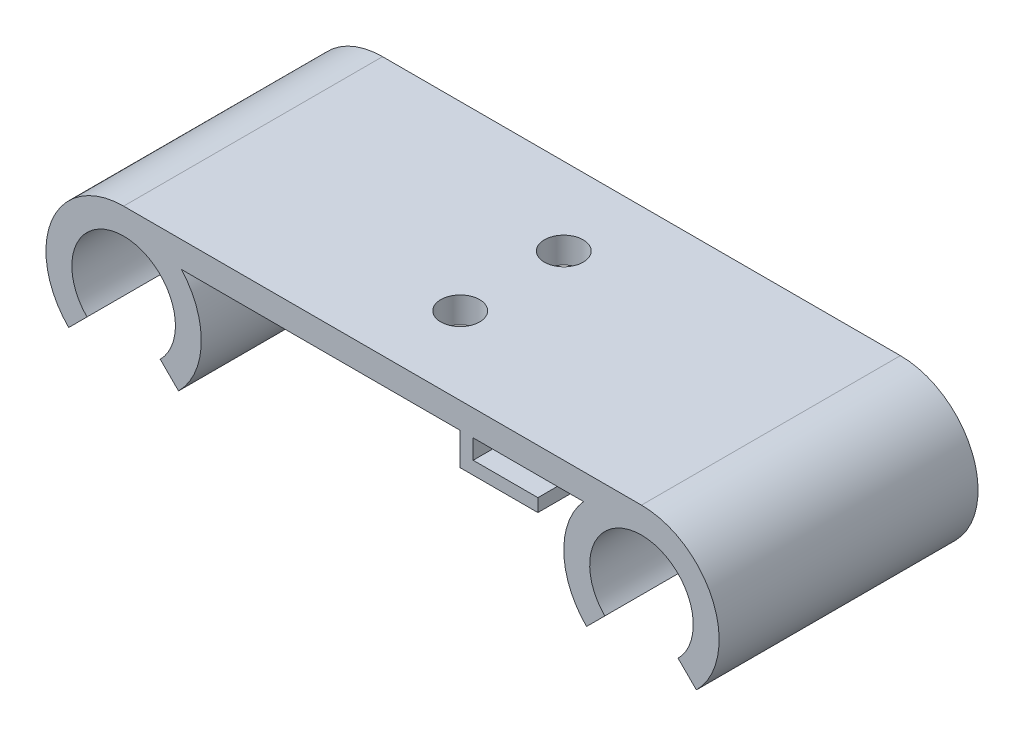
ISO-10303-21;
HEADER;
FILE_DESCRIPTION(('STEP AP214'),'2;1');
FILE_NAME('part.step','',(''),(''),'','','');
FILE_SCHEMA(('AUTOMOTIVE_DESIGN { 1 0 10303 214 1 1 1 1 }'));
ENDSEC;
DATA;
#1=APPLICATION_CONTEXT('core data for automotive mechanical design processes');
#2=APPLICATION_PROTOCOL_DEFINITION('international standard','automotive_design',2000,#1);
#3=PRODUCT_CONTEXT('',#1,'mechanical');
#4=PRODUCT('Part','Part','',(#3));
#5=PRODUCT_RELATED_PRODUCT_CATEGORY('part','',(#4));
#6=PRODUCT_DEFINITION_FORMATION('','',#4);
#7=PRODUCT_DEFINITION_CONTEXT('part definition',#1,'design');
#8=PRODUCT_DEFINITION('design','',#6,#7);
#9=PRODUCT_DEFINITION_SHAPE('','',#8);
#10=(LENGTH_UNIT() NAMED_UNIT(*) SI_UNIT(.MILLI.,.METRE.));
#11=(NAMED_UNIT(*) PLANE_ANGLE_UNIT() SI_UNIT($,.RADIAN.));
#12=(NAMED_UNIT(*) SI_UNIT($,.STERADIAN.) SOLID_ANGLE_UNIT());
#13=UNCERTAINTY_MEASURE_WITH_UNIT(LENGTH_MEASURE(1.E-05),#10,'distance_accuracy_value','');
#14=(GEOMETRIC_REPRESENTATION_CONTEXT(3) GLOBAL_UNCERTAINTY_ASSIGNED_CONTEXT((#13)) GLOBAL_UNIT_ASSIGNED_CONTEXT((#10,
#11,#12)) REPRESENTATION_CONTEXT('',''));
#15=CARTESIAN_POINT('',(0.,0.,0.));
#16=DIRECTION('',(0.,0.,1.));
#17=DIRECTION('',(1.,0.,0.));
#18=AXIS2_PLACEMENT_3D('',#15,#16,#17);
#19=CARTESIAN_POINT('',(6.,6.,20.));
#20=DIRECTION('',(0.,0.,-1.));
#21=DIRECTION('',(-1.,0.,0.));
#22=AXIS2_PLACEMENT_3D('',#19,#20,#21);
#23=CYLINDRICAL_SURFACE('',#22,6.);
#24=CARTESIAN_POINT('',(6.,6.,0.));
#25=DIRECTION('',(0.,0.,1.));
#26=DIRECTION('',(1.,0.,0.));
#27=AXIS2_PLACEMENT_3D('',#24,#25,#26);
#28=CIRCLE('',#27,6.);
#29=CARTESIAN_POINT('',(10.2426406871193,1.75735931288073,0.));
#30=VERTEX_POINT('',#29);
#31=CARTESIAN_POINT('',(10.4721359549996,10.,0.));
#32=VERTEX_POINT('',#31);
#33=EDGE_CURVE('E191',#30,#32,#28,.T.);
#34=ORIENTED_EDGE('',*,*,#33,.T.);
#35=DIRECTION('',(0.,0.,-1.));
#36=VECTOR('',#35,1.);
#37=CARTESIAN_POINT('',(10.4721359549996,10.,20.));
#38=LINE('',#37,#36);
#39=CARTESIAN_POINT('',(10.4721359549996,10.,20.));
#40=VERTEX_POINT('',#39);
#41=EDGE_CURVE('E11',#40,#32,#38,.T.);
#42=ORIENTED_EDGE('',*,*,#41,.F.);
#43=CARTESIAN_POINT('',(6.,6.,20.));
#44=DIRECTION('',(0.,0.,1.));
#45=DIRECTION('',(1.,0.,0.));
#46=AXIS2_PLACEMENT_3D('',#43,#44,#45);
#47=CIRCLE('',#46,6.);
#48=CARTESIAN_POINT('',(10.2426406871193,1.75735931288073,20.));
#49=VERTEX_POINT('',#48);
#50=EDGE_CURVE('E228',#49,#40,#47,.T.);
#51=ORIENTED_EDGE('',*,*,#50,.F.);
#52=DIRECTION('',(0.,0.,-1.));
#53=VECTOR('',#52,1.);
#54=CARTESIAN_POINT('',(10.2426406871193,1.75735931288073,20.));
#55=LINE('',#54,#53);
#56=EDGE_CURVE('E187',#49,#30,#55,.T.);
#57=ORIENTED_EDGE('',*,*,#56,.T.);
#58=EDGE_LOOP('',(#34,#42,#51,#57));
#59=FACE_BOUND('',#58,.T.);
#60=ADVANCED_FACE('F35',(#59),#23,.T.);
#61=CARTESIAN_POINT('',(0.,10.,20.));
#62=DIRECTION('',(0.,1.,0.));
#63=DIRECTION('',(0.,0.,1.));
#64=AXIS2_PLACEMENT_3D('',#61,#62,#63);
#65=PLANE('',#64);
#66=CARTESIAN_POINT('',(26.,10.,14.));
#67=DIRECTION('',(0.,1.,0.));
#68=DIRECTION('',(0.,0.,1.));
#69=AXIS2_PLACEMENT_3D('',#66,#67,#68);
#70=CIRCLE('',#69,1.5);
#71=CARTESIAN_POINT('',(26.,10.,15.5));
#72=VERTEX_POINT('',#71);
#73=EDGE_CURVE('E371',#72,#72,#70,.T.);
#74=ORIENTED_EDGE('',*,*,#73,.T.);
#75=EDGE_LOOP('',(#74));
#76=FACE_BOUND('',#75,.T.);
#77=CARTESIAN_POINT('',(26.,10.,6.));
#78=DIRECTION('',(0.,1.,0.));
#79=DIRECTION('',(0.,0.,1.));
#80=AXIS2_PLACEMENT_3D('',#77,#78,#79);
#81=CIRCLE('',#80,1.5);
#82=CARTESIAN_POINT('',(26.,10.,7.5));
#83=VERTEX_POINT('',#82);
#84=EDGE_CURVE('E195',#83,#83,#81,.T.);
#85=ORIENTED_EDGE('',*,*,#84,.T.);
#86=EDGE_LOOP('',(#85));
#87=FACE_BOUND('',#86,.T.);
#88=DIRECTION('',(1.,0.,0.));
#89=VECTOR('',#88,1.);
#90=CARTESIAN_POINT('',(0.,10.,0.));
#91=LINE('',#90,#89);
#92=CARTESIAN_POINT('',(32.,10.,0.));
#93=VERTEX_POINT('',#92);
#94=EDGE_CURVE('E194',#32,#93,#91,.T.);
#95=ORIENTED_EDGE('',*,*,#94,.T.);
#96=DIRECTION('',(0.,0.,-1.));
#97=VECTOR('',#96,1.);
#98=CARTESIAN_POINT('',(32.,10.,20.));
#99=LINE('',#98,#97);
#100=CARTESIAN_POINT('',(32.,10.,20.));
#101=VERTEX_POINT('',#100);
#102=EDGE_CURVE('E44',#101,#93,#99,.T.);
#103=ORIENTED_EDGE('',*,*,#102,.F.);
#104=DIRECTION('',(1.,0.,0.));
#105=VECTOR('',#104,1.);
#106=CARTESIAN_POINT('',(0.,10.,20.));
#107=LINE('',#106,#105);
#108=EDGE_CURVE('E121',#40,#101,#107,.T.);
#109=ORIENTED_EDGE('',*,*,#108,.F.);
#110=ORIENTED_EDGE('',*,*,#41,.T.);
#111=EDGE_LOOP('',(#95,#103,#109,#110));
#112=FACE_BOUND('',#111,.T.);
#113=ADVANCED_FACE('F334',(#76,#87,#112),#65,.F.);
#114=CARTESIAN_POINT('',(32.,0.,20.));
#115=DIRECTION('',(1.,0.,0.));
#116=DIRECTION('',(0.,0.,-1.));
#117=AXIS2_PLACEMENT_3D('',#114,#115,#116);
#118=PLANE('',#117);
#119=DIRECTION('',(0.,-1.,0.));
#120=VECTOR('',#119,1.);
#121=CARTESIAN_POINT('',(32.,0.,0.));
#122=LINE('',#121,#120);
#123=CARTESIAN_POINT('',(32.,7.5,0.));
#124=VERTEX_POINT('',#123);
#125=EDGE_CURVE('E198',#93,#124,#122,.T.);
#126=ORIENTED_EDGE('',*,*,#125,.T.);
#127=DIRECTION('',(0.,0.,-1.));
#128=VECTOR('',#127,1.);
#129=CARTESIAN_POINT('',(32.,7.5,20.));
#130=LINE('',#129,#128);
#131=CARTESIAN_POINT('',(32.,7.5,20.));
#132=VERTEX_POINT('',#131);
#133=EDGE_CURVE('E260',#132,#124,#130,.T.);
#134=ORIENTED_EDGE('',*,*,#133,.F.);
#135=DIRECTION('',(0.,-1.,0.));
#136=VECTOR('',#135,1.);
#137=CARTESIAN_POINT('',(32.,0.,20.));
#138=LINE('',#137,#136);
#139=EDGE_CURVE('E267',#101,#132,#138,.T.);
#140=ORIENTED_EDGE('',*,*,#139,.F.);
#141=ORIENTED_EDGE('',*,*,#102,.T.);
#142=EDGE_LOOP('',(#126,#134,#140,#141));
#143=FACE_BOUND('',#142,.T.);
#144=ADVANCED_FACE('F37',(#143),#118,.F.);
#145=CARTESIAN_POINT('',(0.,7.5,20.));
#146=DIRECTION('',(0.,1.,0.));
#147=DIRECTION('',(0.,0.,1.));
#148=AXIS2_PLACEMENT_3D('',#145,#146,#147);
#149=PLANE('',#148);
#150=DIRECTION('',(1.,0.,0.));
#151=VECTOR('',#150,1.);
#152=CARTESIAN_POINT('',(0.,7.5,0.));
#153=LINE('',#152,#151);
#154=CARTESIAN_POINT('',(38.,7.5,0.));
#155=VERTEX_POINT('',#154);
#156=EDGE_CURVE('E201',#124,#155,#153,.T.);
#157=ORIENTED_EDGE('',*,*,#156,.T.);
#158=DIRECTION('',(0.,0.,-1.));
#159=VECTOR('',#158,1.);
#160=CARTESIAN_POINT('',(38.,7.5,20.));
#161=LINE('',#160,#159);
#162=CARTESIAN_POINT('',(38.,7.5,20.));
#163=VERTEX_POINT('',#162);
#164=EDGE_CURVE('E257',#163,#155,#161,.T.);
#165=ORIENTED_EDGE('',*,*,#164,.F.);
#166=DIRECTION('',(1.,0.,0.));
#167=VECTOR('',#166,1.);
#168=CARTESIAN_POINT('',(0.,7.5,20.));
#169=LINE('',#168,#167);
#170=EDGE_CURVE('E285',#132,#163,#169,.T.);
#171=ORIENTED_EDGE('',*,*,#170,.F.);
#172=ORIENTED_EDGE('',*,*,#133,.T.);
#173=EDGE_LOOP('',(#157,#165,#171,#172));
#174=FACE_BOUND('',#173,.T.);
#175=ADVANCED_FACE('F276',(#174),#149,.F.);
#176=CARTESIAN_POINT('',(38.,0.,20.));
#177=DIRECTION('',(-1.,0.,0.));
#178=DIRECTION('',(0.,0.,1.));
#179=AXIS2_PLACEMENT_3D('',#176,#177,#178);
#180=PLANE('',#179);
#181=DIRECTION('',(0.,1.,0.));
#182=VECTOR('',#181,1.);
#183=CARTESIAN_POINT('',(38.,0.,0.));
#184=LINE('',#183,#182);
#185=CARTESIAN_POINT('',(38.,8.5,0.));
#186=VERTEX_POINT('',#185);
#187=EDGE_CURVE('E203',#155,#186,#184,.T.);
#188=ORIENTED_EDGE('',*,*,#187,.T.);
#189=DIRECTION('',(0.,0.,-1.));
#190=VECTOR('',#189,1.);
#191=CARTESIAN_POINT('',(38.,8.5,20.));
#192=LINE('',#191,#190);
#193=CARTESIAN_POINT('',(38.,8.5,20.));
#194=VERTEX_POINT('',#193);
#195=EDGE_CURVE('E254',#194,#186,#192,.T.);
#196=ORIENTED_EDGE('',*,*,#195,.F.);
#197=DIRECTION('',(0.,1.,0.));
#198=VECTOR('',#197,1.);
#199=CARTESIAN_POINT('',(38.,0.,20.));
#200=LINE('',#199,#198);
#201=EDGE_CURVE('E282',#163,#194,#200,.T.);
#202=ORIENTED_EDGE('',*,*,#201,.F.);
#203=ORIENTED_EDGE('',*,*,#164,.T.);
#204=EDGE_LOOP('',(#188,#196,#202,#203));
#205=FACE_BOUND('',#204,.T.);
#206=ADVANCED_FACE('F280',(#205),#180,.F.);
#207=CARTESIAN_POINT('',(0.,8.5,20.));
#208=DIRECTION('',(0.,-1.,0.));
#209=DIRECTION('',(0.,0.,-1.));
#210=AXIS2_PLACEMENT_3D('',#207,#208,#209);
#211=PLANE('',#210);
#212=DIRECTION('',(-1.,0.,0.));
#213=VECTOR('',#212,1.);
#214=CARTESIAN_POINT('',(0.,8.5,0.));
#215=LINE('',#214,#213);
#216=CARTESIAN_POINT('',(33.,8.5,0.));
#217=VERTEX_POINT('',#216);
#218=EDGE_CURVE('E205',#186,#217,#215,.T.);
#219=ORIENTED_EDGE('',*,*,#218,.T.);
#220=DIRECTION('',(0.,0.,-1.));
#221=VECTOR('',#220,1.);
#222=CARTESIAN_POINT('',(33.,8.5,20.));
#223=LINE('',#222,#221);
#224=CARTESIAN_POINT('',(33.,8.5,20.));
#225=VERTEX_POINT('',#224);
#226=EDGE_CURVE('E251',#225,#217,#223,.T.);
#227=ORIENTED_EDGE('',*,*,#226,.F.);
#228=DIRECTION('',(-1.,0.,0.));
#229=VECTOR('',#228,1.);
#230=CARTESIAN_POINT('',(0.,8.5,20.));
#231=LINE('',#230,#229);
#232=EDGE_CURVE('E284',#194,#225,#231,.T.);
#233=ORIENTED_EDGE('',*,*,#232,.F.);
#234=ORIENTED_EDGE('',*,*,#195,.T.);
#235=EDGE_LOOP('',(#219,#227,#233,#234));
#236=FACE_BOUND('',#235,.T.);
#237=ADVANCED_FACE('F405',(#236),#211,.F.);
#238=CARTESIAN_POINT('',(33.,0.,20.));
#239=DIRECTION('',(-1.,0.,0.));
#240=DIRECTION('',(0.,0.,1.));
#241=AXIS2_PLACEMENT_3D('',#238,#239,#240);
#242=PLANE('',#241);
#243=DIRECTION('',(0.,1.,0.));
#244=VECTOR('',#243,1.);
#245=CARTESIAN_POINT('',(33.,0.,0.));
#246=LINE('',#245,#244);
#247=CARTESIAN_POINT('',(33.,10.,0.));
#248=VERTEX_POINT('',#247);
#249=EDGE_CURVE('E207',#217,#248,#246,.T.);
#250=ORIENTED_EDGE('',*,*,#249,.T.);
#251=DIRECTION('',(0.,0.,-1.));
#252=VECTOR('',#251,1.);
#253=CARTESIAN_POINT('',(33.,10.,20.));
#254=LINE('',#253,#252);
#255=CARTESIAN_POINT('',(33.,10.,20.));
#256=VERTEX_POINT('',#255);
#257=EDGE_CURVE('E248',#256,#248,#254,.T.);
#258=ORIENTED_EDGE('',*,*,#257,.F.);
#259=DIRECTION('',(0.,1.,0.));
#260=VECTOR('',#259,1.);
#261=CARTESIAN_POINT('',(33.,0.,20.));
#262=LINE('',#261,#260);
#263=EDGE_CURVE('E287',#225,#256,#262,.T.);
#264=ORIENTED_EDGE('',*,*,#263,.F.);
#265=ORIENTED_EDGE('',*,*,#226,.T.);
#266=EDGE_LOOP('',(#250,#258,#264,#265));
#267=FACE_BOUND('',#266,.T.);
#268=ADVANCED_FACE('F402',(#267),#242,.F.);
#269=CARTESIAN_POINT('',(41.5278640450004,10.,0.));
#270=VERTEX_POINT('',#269);
#271=EDGE_CURVE('E199',#248,#270,#91,.T.);
#272=ORIENTED_EDGE('',*,*,#271,.T.);
#273=DIRECTION('',(0.,0.,-1.));
#274=VECTOR('',#273,1.);
#275=CARTESIAN_POINT('',(41.5278640450004,10.,20.));
#276=LINE('',#275,#274);
#277=CARTESIAN_POINT('',(41.5278640450004,10.,20.));
#278=VERTEX_POINT('',#277);
#279=EDGE_CURVE('E245',#278,#270,#276,.T.);
#280=ORIENTED_EDGE('',*,*,#279,.F.);
#281=EDGE_CURVE('E293',#256,#278,#107,.T.);
#282=ORIENTED_EDGE('',*,*,#281,.F.);
#283=ORIENTED_EDGE('',*,*,#257,.T.);
#284=EDGE_LOOP('',(#272,#280,#282,#283));
#285=FACE_BOUND('',#284,.T.);
#286=ADVANCED_FACE('F341',(#285),#65,.F.);
#287=CARTESIAN_POINT('',(46.,6.,20.));
#288=DIRECTION('',(0.,0.,-1.));
#289=DIRECTION('',(-1.,0.,0.));
#290=AXIS2_PLACEMENT_3D('',#287,#288,#289);
#291=CYLINDRICAL_SURFACE('',#290,6.);
#292=CARTESIAN_POINT('',(46.,6.,0.));
#293=DIRECTION('',(0.,0.,1.));
#294=DIRECTION('',(1.,0.,0.));
#295=AXIS2_PLACEMENT_3D('',#292,#293,#294);
#296=CIRCLE('',#295,6.);
#297=CARTESIAN_POINT('',(41.7573593128807,1.75735931288072,0.));
#298=VERTEX_POINT('',#297);
#299=EDGE_CURVE('E209',#270,#298,#296,.T.);
#300=ORIENTED_EDGE('',*,*,#299,.T.);
#301=DIRECTION('',(0.,0.,-1.));
#302=VECTOR('',#301,1.);
#303=CARTESIAN_POINT('',(41.7573593128807,1.75735931288072,20.));
#304=LINE('',#303,#302);
#305=CARTESIAN_POINT('',(41.7573593128807,1.75735931288072,20.));
#306=VERTEX_POINT('',#305);
#307=EDGE_CURVE('E243',#306,#298,#304,.T.);
#308=ORIENTED_EDGE('',*,*,#307,.F.);
#309=CARTESIAN_POINT('',(46.,6.,20.));
#310=DIRECTION('',(0.,0.,1.));
#311=DIRECTION('',(1.,0.,0.));
#312=AXIS2_PLACEMENT_3D('',#309,#310,#311);
#313=CIRCLE('',#312,6.);
#314=EDGE_CURVE('E294',#278,#306,#313,.T.);
#315=ORIENTED_EDGE('',*,*,#314,.F.);
#316=ORIENTED_EDGE('',*,*,#279,.T.);
#317=EDGE_LOOP('',(#300,#308,#315,#316));
#318=FACE_BOUND('',#317,.T.);
#319=ADVANCED_FACE('F391',(#318),#291,.T.);
#320=CARTESIAN_POINT('',(19.9999999999999,-20.,20.));
#321=DIRECTION('',(0.707106781186547,-0.707106781186548,0.));
#322=DIRECTION('',(0.707106781186548,0.707106781186547,0.));
#323=AXIS2_PLACEMENT_3D('',#320,#321,#322);
#324=PLANE('',#323);
#325=DIRECTION('',(-0.707106781186548,-0.707106781186547,0.));
#326=VECTOR('',#325,1.);
#327=CARTESIAN_POINT('',(19.9999999999999,-20.,0.));
#328=LINE('',#327,#326);
#329=CARTESIAN_POINT('',(43.1715728752538,3.17157287525381,0.));
#330=VERTEX_POINT('',#329);
#331=EDGE_CURVE('E212',#330,#298,#328,.T.);
#332=ORIENTED_EDGE('',*,*,#331,.F.);
#333=DIRECTION('',(0.,0.,-1.));
#334=VECTOR('',#333,1.);
#335=CARTESIAN_POINT('',(43.1715728752538,3.17157287525381,20.));
#336=LINE('',#335,#334);
#337=CARTESIAN_POINT('',(43.1715728752538,3.17157287525381,20.));
#338=VERTEX_POINT('',#337);
#339=EDGE_CURVE('E241',#338,#330,#336,.T.);
#340=ORIENTED_EDGE('',*,*,#339,.F.);
#341=DIRECTION('',(-0.707106781186548,-0.707106781186547,0.));
#342=VECTOR('',#341,1.);
#343=CARTESIAN_POINT('',(19.9999999999999,-20.,20.));
#344=LINE('',#343,#342);
#345=EDGE_CURVE('E296',#338,#306,#344,.T.);
#346=ORIENTED_EDGE('',*,*,#345,.T.);
#347=ORIENTED_EDGE('',*,*,#307,.T.);
#348=EDGE_LOOP('',(#332,#340,#346,#347));
#349=FACE_BOUND('',#348,.T.);
#350=ADVANCED_FACE('F394',(#349),#324,.T.);
#351=CARTESIAN_POINT('',(46.,6.,20.));
#352=DIRECTION('',(0.,0.,-1.));
#353=DIRECTION('',(-1.,0.,0.));
#354=AXIS2_PLACEMENT_3D('',#351,#352,#353);
#355=CYLINDRICAL_SURFACE('',#354,4.00000000000001);
#356=CARTESIAN_POINT('',(46.,6.,0.));
#357=DIRECTION('',(0.,0.,1.));
#358=DIRECTION('',(1.,0.,0.));
#359=AXIS2_PLACEMENT_3D('',#356,#357,#358);
#360=CIRCLE('',#359,4.00000000000001);
#361=CARTESIAN_POINT('',(48.8284271247462,3.1715728752538,0.));
#362=VERTEX_POINT('',#361);
#363=EDGE_CURVE('E216',#362,#330,#360,.T.);
#364=ORIENTED_EDGE('',*,*,#363,.F.);
#365=DIRECTION('',(0.,0.,-1.));
#366=VECTOR('',#365,1.);
#367=CARTESIAN_POINT('',(48.8284271247462,3.1715728752538,20.));
#368=LINE('',#367,#366);
#369=CARTESIAN_POINT('',(48.8284271247462,3.1715728752538,20.));
#370=VERTEX_POINT('',#369);
#371=EDGE_CURVE('E239',#370,#362,#368,.T.);
#372=ORIENTED_EDGE('',*,*,#371,.F.);
#373=CARTESIAN_POINT('',(46.,6.,20.));
#374=DIRECTION('',(0.,0.,1.));
#375=DIRECTION('',(1.,0.,0.));
#376=AXIS2_PLACEMENT_3D('',#373,#374,#375);
#377=CIRCLE('',#376,4.00000000000001);
#378=EDGE_CURVE('E300',#370,#338,#377,.T.);
#379=ORIENTED_EDGE('',*,*,#378,.T.);
#380=ORIENTED_EDGE('',*,*,#339,.T.);
#381=EDGE_LOOP('',(#364,#372,#379,#380));
#382=FACE_BOUND('',#381,.T.);
#383=ADVANCED_FACE('F397',(#382),#355,.F.);
#384=CARTESIAN_POINT('',(26.,26.,20.));
#385=DIRECTION('',(0.707106781186548,0.707106781186547,0.));
#386=DIRECTION('',(-0.707106781186547,0.707106781186548,0.));
#387=AXIS2_PLACEMENT_3D('',#384,#385,#386);
#388=PLANE('',#387);
#389=DIRECTION('',(0.707106781186547,-0.707106781186548,0.));
#390=VECTOR('',#389,1.);
#391=CARTESIAN_POINT('',(26.,26.,0.));
#392=LINE('',#391,#390);
#393=CARTESIAN_POINT('',(50.2426406871193,1.75735931288071,0.));
#394=VERTEX_POINT('',#393);
#395=EDGE_CURVE('E219',#362,#394,#392,.T.);
#396=ORIENTED_EDGE('',*,*,#395,.T.);
#397=DIRECTION('',(0.,0.,-1.));
#398=VECTOR('',#397,1.);
#399=CARTESIAN_POINT('',(50.2426406871193,1.75735931288071,20.));
#400=LINE('',#399,#398);
#401=CARTESIAN_POINT('',(50.2426406871193,1.75735931288071,20.));
#402=VERTEX_POINT('',#401);
#403=EDGE_CURVE('E236',#402,#394,#400,.T.);
#404=ORIENTED_EDGE('',*,*,#403,.F.);
#405=DIRECTION('',(0.707106781186547,-0.707106781186548,0.));
#406=VECTOR('',#405,1.);
#407=CARTESIAN_POINT('',(26.,26.,20.));
#408=LINE('',#407,#406);
#409=EDGE_CURVE('E303',#370,#402,#408,.T.);
#410=ORIENTED_EDGE('',*,*,#409,.F.);
#411=ORIENTED_EDGE('',*,*,#371,.T.);
#412=EDGE_LOOP('',(#396,#404,#410,#411));
#413=FACE_BOUND('',#412,.T.);
#414=ADVANCED_FACE('F399',(#413),#388,.F.);
#415=CARTESIAN_POINT('',(46.,12.,0.));
#416=VERTEX_POINT('',#415);
#417=EDGE_CURVE('E213',#394,#416,#296,.T.);
#418=ORIENTED_EDGE('',*,*,#417,.T.);
#419=DIRECTION('',(0.,0.,-1.));
#420=VECTOR('',#419,1.);
#421=CARTESIAN_POINT('',(46.,12.,20.));
#422=LINE('',#421,#420);
#423=CARTESIAN_POINT('',(46.,12.,20.));
#424=VERTEX_POINT('',#423);
#425=EDGE_CURVE('E234',#424,#416,#422,.T.);
#426=ORIENTED_EDGE('',*,*,#425,.F.);
#427=EDGE_CURVE('E297',#402,#424,#313,.T.);
#428=ORIENTED_EDGE('',*,*,#427,.F.);
#429=ORIENTED_EDGE('',*,*,#403,.T.);
#430=EDGE_LOOP('',(#418,#426,#428,#429));
#431=FACE_BOUND('',#430,.T.);
#432=ADVANCED_FACE('F315',(#431),#291,.T.);
#433=CARTESIAN_POINT('',(0.,12.,20.));
#434=DIRECTION('',(0.,1.,0.));
#435=DIRECTION('',(0.,0.,1.));
#436=AXIS2_PLACEMENT_3D('',#433,#434,#435);
#437=PLANE('',#436);
#438=CARTESIAN_POINT('',(26.,12.,14.));
#439=DIRECTION('',(0.,1.,0.));
#440=DIRECTION('',(0.,0.,1.));
#441=AXIS2_PLACEMENT_3D('',#438,#439,#440);
#442=CIRCLE('',#441,1.5);
#443=CARTESIAN_POINT('',(26.,12.,15.5));
#444=VERTEX_POINT('',#443);
#445=EDGE_CURVE('E368',#444,#444,#442,.T.);
#446=ORIENTED_EDGE('',*,*,#445,.F.);
#447=EDGE_LOOP('',(#446));
#448=FACE_BOUND('',#447,.T.);
#449=CARTESIAN_POINT('',(26.,12.,6.));
#450=DIRECTION('',(0.,1.,0.));
#451=DIRECTION('',(0.,0.,1.));
#452=AXIS2_PLACEMENT_3D('',#449,#450,#451);
#453=CIRCLE('',#452,1.5);
#454=CARTESIAN_POINT('',(26.,12.,7.5));
#455=VERTEX_POINT('',#454);
#456=EDGE_CURVE('E372',#455,#455,#453,.T.);
#457=ORIENTED_EDGE('',*,*,#456,.F.);
#458=EDGE_LOOP('',(#457));
#459=FACE_BOUND('',#458,.T.);
#460=DIRECTION('',(1.,0.,0.));
#461=VECTOR('',#460,1.);
#462=CARTESIAN_POINT('',(0.,12.,0.));
#463=LINE('',#462,#461);
#464=CARTESIAN_POINT('',(6.,12.,0.));
#465=VERTEX_POINT('',#464);
#466=EDGE_CURVE('E221',#465,#416,#463,.T.);
#467=ORIENTED_EDGE('',*,*,#466,.F.);
#468=DIRECTION('',(0.,0.,-1.));
#469=VECTOR('',#468,1.);
#470=CARTESIAN_POINT('',(6.,12.,20.));
#471=LINE('',#470,#469);
#472=CARTESIAN_POINT('',(6.,12.,20.));
#473=VERTEX_POINT('',#472);
#474=EDGE_CURVE('E232',#473,#465,#471,.T.);
#475=ORIENTED_EDGE('',*,*,#474,.F.);
#476=DIRECTION('',(1.,0.,0.));
#477=VECTOR('',#476,1.);
#478=CARTESIAN_POINT('',(0.,12.,20.));
#479=LINE('',#478,#477);
#480=EDGE_CURVE('E304',#473,#424,#479,.T.);
#481=ORIENTED_EDGE('',*,*,#480,.T.);
#482=ORIENTED_EDGE('',*,*,#425,.T.);
#483=EDGE_LOOP('',(#467,#475,#481,#482));
#484=FACE_BOUND('',#483,.T.);
#485=ADVANCED_FACE('F318',(#448,#459,#484),#437,.T.);
#486=CARTESIAN_POINT('',(1.75735931288071,1.75735931288071,0.));
#487=VERTEX_POINT('',#486);
#488=EDGE_CURVE('E196',#465,#487,#28,.T.);
#489=ORIENTED_EDGE('',*,*,#488,.T.);
#490=DIRECTION('',(0.,0.,-1.));
#491=VECTOR('',#490,1.);
#492=CARTESIAN_POINT('',(1.75735931288071,1.75735931288071,20.));
#493=LINE('',#492,#491);
#494=CARTESIAN_POINT('',(1.75735931288071,1.75735931288071,20.));
#495=VERTEX_POINT('',#494);
#496=EDGE_CURVE('E176',#495,#487,#493,.T.);
#497=ORIENTED_EDGE('',*,*,#496,.F.);
#498=EDGE_CURVE('E182',#473,#495,#47,.T.);
#499=ORIENTED_EDGE('',*,*,#498,.F.);
#500=ORIENTED_EDGE('',*,*,#474,.T.);
#501=EDGE_LOOP('',(#489,#497,#499,#500));
#502=FACE_BOUND('',#501,.T.);
#503=ADVANCED_FACE('F323',(#502),#23,.T.);
#504=CARTESIAN_POINT('',(0.,0.,20.));
#505=DIRECTION('',(0.707106781186548,-0.707106781186548,0.));
#506=DIRECTION('',(0.707106781186548,0.707106781186548,0.));
#507=AXIS2_PLACEMENT_3D('',#504,#505,#506);
#508=PLANE('',#507);
#509=DIRECTION('',(-0.707106781186548,-0.707106781186548,0.));
#510=VECTOR('',#509,1.);
#511=CARTESIAN_POINT('',(0.,0.,0.));
#512=LINE('',#511,#510);
#513=CARTESIAN_POINT('',(3.17157287525381,3.17157287525381,0.));
#514=VERTEX_POINT('',#513);
#515=EDGE_CURVE('E171',#514,#487,#512,.T.);
#516=ORIENTED_EDGE('',*,*,#515,.F.);
#517=DIRECTION('',(0.,0.,-1.));
#518=VECTOR('',#517,1.);
#519=CARTESIAN_POINT('',(3.17157287525381,3.17157287525381,20.));
#520=LINE('',#519,#518);
#521=CARTESIAN_POINT('',(3.17157287525381,3.17157287525381,20.));
#522=VERTEX_POINT('',#521);
#523=EDGE_CURVE('E166',#522,#514,#520,.T.);
#524=ORIENTED_EDGE('',*,*,#523,.F.);
#525=DIRECTION('',(-0.707106781186548,-0.707106781186548,0.));
#526=VECTOR('',#525,1.);
#527=CARTESIAN_POINT('',(0.,0.,20.));
#528=LINE('',#527,#526);
#529=EDGE_CURVE('E169',#522,#495,#528,.T.);
#530=ORIENTED_EDGE('',*,*,#529,.T.);
#531=ORIENTED_EDGE('',*,*,#496,.T.);
#532=EDGE_LOOP('',(#516,#524,#530,#531));
#533=FACE_BOUND('',#532,.T.);
#534=ADVANCED_FACE('F168',(#533),#508,.T.);
#535=CARTESIAN_POINT('',(6.,6.,20.));
#536=DIRECTION('',(0.,0.,-1.));
#537=DIRECTION('',(-1.,0.,0.));
#538=AXIS2_PLACEMENT_3D('',#535,#536,#537);
#539=CYLINDRICAL_SURFACE('',#538,4.);
#540=CARTESIAN_POINT('',(6.,6.,0.));
#541=DIRECTION('',(0.,0.,1.));
#542=DIRECTION('',(1.,0.,0.));
#543=AXIS2_PLACEMENT_3D('',#540,#541,#542);
#544=CIRCLE('',#543,4.);
#545=CARTESIAN_POINT('',(8.8284271247462,3.17157287525382,0.));
#546=VERTEX_POINT('',#545);
#547=EDGE_CURVE('E225',#546,#514,#544,.T.);
#548=ORIENTED_EDGE('',*,*,#547,.F.);
#549=DIRECTION('',(0.,0.,-1.));
#550=VECTOR('',#549,1.);
#551=CARTESIAN_POINT('',(8.8284271247462,3.17157287525382,20.));
#552=LINE('',#551,#550);
#553=CARTESIAN_POINT('',(8.8284271247462,3.17157287525382,20.));
#554=VERTEX_POINT('',#553);
#555=EDGE_CURVE('E110',#554,#546,#552,.T.);
#556=ORIENTED_EDGE('',*,*,#555,.F.);
#557=CARTESIAN_POINT('',(6.,6.,20.));
#558=DIRECTION('',(0.,0.,1.));
#559=DIRECTION('',(1.,0.,0.));
#560=AXIS2_PLACEMENT_3D('',#557,#558,#559);
#561=CIRCLE('',#560,4.);
#562=EDGE_CURVE('E179',#554,#522,#561,.T.);
#563=ORIENTED_EDGE('',*,*,#562,.T.);
#564=ORIENTED_EDGE('',*,*,#523,.T.);
#565=EDGE_LOOP('',(#548,#556,#563,#564));
#566=FACE_BOUND('',#565,.T.);
#567=ADVANCED_FACE('F185',(#566),#539,.F.);
#568=CARTESIAN_POINT('',(5.99999999999998,6.00000000000002,20.));
#569=DIRECTION('',(0.707106781186545,0.70710678118655,0.));
#570=DIRECTION('',(-0.70710678118655,0.707106781186545,0.));
#571=AXIS2_PLACEMENT_3D('',#568,#569,#570);
#572=PLANE('',#571);
#573=DIRECTION('',(0.70710678118655,-0.707106781186545,0.));
#574=VECTOR('',#573,1.);
#575=CARTESIAN_POINT('',(5.99999999999998,6.00000000000002,0.));
#576=LINE('',#575,#574);
#577=EDGE_CURVE('E113',#546,#30,#576,.T.);
#578=ORIENTED_EDGE('',*,*,#577,.T.);
#579=ORIENTED_EDGE('',*,*,#56,.F.);
#580=DIRECTION('',(0.70710678118655,-0.707106781186545,0.));
#581=VECTOR('',#580,1.);
#582=CARTESIAN_POINT('',(5.99999999999998,6.00000000000002,20.));
#583=LINE('',#582,#581);
#584=EDGE_CURVE('E52',#554,#49,#583,.T.);
#585=ORIENTED_EDGE('',*,*,#584,.F.);
#586=ORIENTED_EDGE('',*,*,#555,.T.);
#587=EDGE_LOOP('',(#578,#579,#585,#586));
#588=FACE_BOUND('',#587,.T.);
#589=ADVANCED_FACE('F344',(#588),#572,.F.);
#590=CARTESIAN_POINT('',(0.,0.,20.));
#591=DIRECTION('',(0.,0.,1.));
#592=DIRECTION('',(1.,0.,0.));
#593=AXIS2_PLACEMENT_3D('',#590,#591,#592);
#594=PLANE('',#593);
#595=ORIENTED_EDGE('',*,*,#50,.T.);
#596=ORIENTED_EDGE('',*,*,#108,.T.);
#597=ORIENTED_EDGE('',*,*,#139,.T.);
#598=ORIENTED_EDGE('',*,*,#170,.T.);
#599=ORIENTED_EDGE('',*,*,#201,.T.);
#600=ORIENTED_EDGE('',*,*,#232,.T.);
#601=ORIENTED_EDGE('',*,*,#263,.T.);
#602=ORIENTED_EDGE('',*,*,#281,.T.);
#603=ORIENTED_EDGE('',*,*,#314,.T.);
#604=ORIENTED_EDGE('',*,*,#345,.F.);
#605=ORIENTED_EDGE('',*,*,#378,.F.);
#606=ORIENTED_EDGE('',*,*,#409,.T.);
#607=ORIENTED_EDGE('',*,*,#427,.T.);
#608=ORIENTED_EDGE('',*,*,#480,.F.);
#609=ORIENTED_EDGE('',*,*,#498,.T.);
#610=ORIENTED_EDGE('',*,*,#529,.F.);
#611=ORIENTED_EDGE('',*,*,#562,.F.);
#612=ORIENTED_EDGE('',*,*,#584,.T.);
#613=EDGE_LOOP('',(#595,#596,#597,#598,#599,#600,#601,#602,#603,#604,#605,#606,#607,#608,#609,
#610,#611,#612));
#614=FACE_BOUND('',#613,.T.);
#615=ADVANCED_FACE('F178',(#614),#594,.T.);
#616=CARTESIAN_POINT('',(0.,0.,0.));
#617=DIRECTION('',(0.,0.,1.));
#618=DIRECTION('',(1.,0.,0.));
#619=AXIS2_PLACEMENT_3D('',#616,#617,#618);
#620=PLANE('',#619);
#621=ORIENTED_EDGE('',*,*,#33,.F.);
#622=ORIENTED_EDGE('',*,*,#577,.F.);
#623=ORIENTED_EDGE('',*,*,#547,.T.);
#624=ORIENTED_EDGE('',*,*,#515,.T.);
#625=ORIENTED_EDGE('',*,*,#488,.F.);
#626=ORIENTED_EDGE('',*,*,#466,.T.);
#627=ORIENTED_EDGE('',*,*,#417,.F.);
#628=ORIENTED_EDGE('',*,*,#395,.F.);
#629=ORIENTED_EDGE('',*,*,#363,.T.);
#630=ORIENTED_EDGE('',*,*,#331,.T.);
#631=ORIENTED_EDGE('',*,*,#299,.F.);
#632=ORIENTED_EDGE('',*,*,#271,.F.);
#633=ORIENTED_EDGE('',*,*,#249,.F.);
#634=ORIENTED_EDGE('',*,*,#218,.F.);
#635=ORIENTED_EDGE('',*,*,#187,.F.);
#636=ORIENTED_EDGE('',*,*,#156,.F.);
#637=ORIENTED_EDGE('',*,*,#125,.F.);
#638=ORIENTED_EDGE('',*,*,#94,.F.);
#639=EDGE_LOOP('',(#621,#622,#623,#624,#625,#626,#627,#628,#629,#630,#631,#632,#633,#634,#635,
#636,#637,#638));
#640=FACE_BOUND('',#639,.T.);
#641=ADVANCED_FACE('F271',(#640),#620,.F.);
#642=CARTESIAN_POINT('',(26.,-8.,6.));
#643=DIRECTION('',(0.,1.,0.));
#644=DIRECTION('',(0.,0.,1.));
#645=AXIS2_PLACEMENT_3D('',#642,#643,#644);
#646=CYLINDRICAL_SURFACE('',#645,1.5);
#647=ORIENTED_EDGE('',*,*,#456,.T.);
#648=EDGE_LOOP('',(#647));
#649=FACE_BOUND('',#648,.T.);
#650=ORIENTED_EDGE('',*,*,#84,.F.);
#651=EDGE_LOOP('',(#650));
#652=FACE_BOUND('',#651,.T.);
#653=ADVANCED_FACE('F355',(#649,#652),#646,.F.);
#654=CARTESIAN_POINT('',(26.,-8.,14.));
#655=DIRECTION('',(0.,1.,0.));
#656=DIRECTION('',(0.,0.,1.));
#657=AXIS2_PLACEMENT_3D('',#654,#655,#656);
#658=CYLINDRICAL_SURFACE('',#657,1.5);
#659=ORIENTED_EDGE('',*,*,#445,.T.);
#660=EDGE_LOOP('',(#659));
#661=FACE_BOUND('',#660,.T.);
#662=ORIENTED_EDGE('',*,*,#73,.F.);
#663=EDGE_LOOP('',(#662));
#664=FACE_BOUND('',#663,.T.);
#665=ADVANCED_FACE('F359',(#661,#664),#658,.F.);
#666=CLOSED_SHELL('',(#60,#113,#144,#175,#206,#237,#268,#286,#319,#350,#383,#414,#432,#485,#503,
#534,#567,#589,#615,#641,#653,#665));
#667=MANIFOLD_SOLID_BREP('B2',#666);
#668=ADVANCED_BREP_SHAPE_REPRESENTATION('',(#18,#667),#14);
#669=SHAPE_DEFINITION_REPRESENTATION(#9,#668);
ENDSEC;
END-ISO-10303-21;
